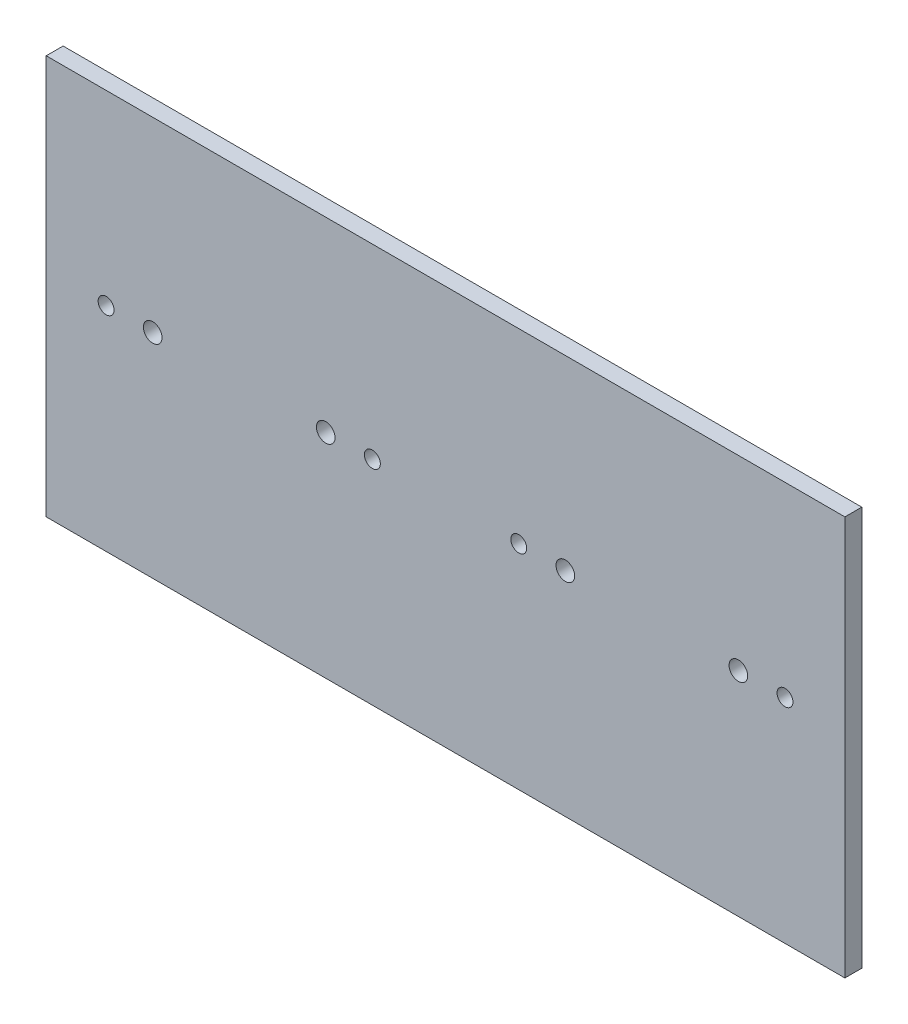
ISO-10303-21;
HEADER;
FILE_DESCRIPTION(('STEP AP214'),'2;1');
FILE_NAME('part.step','',(''),(''),'','','');
FILE_SCHEMA(('AUTOMOTIVE_DESIGN { 1 0 10303 214 1 1 1 1 }'));
ENDSEC;
DATA;
#1=APPLICATION_CONTEXT('core data for automotive mechanical design processes');
#2=APPLICATION_PROTOCOL_DEFINITION('international standard','automotive_design',2000,#1);
#3=PRODUCT_CONTEXT('',#1,'mechanical');
#4=PRODUCT('Part','Part','',(#3));
#5=PRODUCT_RELATED_PRODUCT_CATEGORY('part','',(#4));
#6=PRODUCT_DEFINITION_FORMATION('','',#4);
#7=PRODUCT_DEFINITION_CONTEXT('part definition',#1,'design');
#8=PRODUCT_DEFINITION('design','',#6,#7);
#9=PRODUCT_DEFINITION_SHAPE('','',#8);
#10=(LENGTH_UNIT() NAMED_UNIT(*) SI_UNIT(.MILLI.,.METRE.));
#11=(NAMED_UNIT(*) PLANE_ANGLE_UNIT() SI_UNIT($,.RADIAN.));
#12=(NAMED_UNIT(*) SI_UNIT($,.STERADIAN.) SOLID_ANGLE_UNIT());
#13=UNCERTAINTY_MEASURE_WITH_UNIT(LENGTH_MEASURE(1.E-05),#10,'distance_accuracy_value','');
#14=(GEOMETRIC_REPRESENTATION_CONTEXT(3) GLOBAL_UNCERTAINTY_ASSIGNED_CONTEXT((#13)) GLOBAL_UNIT_ASSIGNED_CONTEXT((#10,
#11,#12)) REPRESENTATION_CONTEXT('',''));
#15=CARTESIAN_POINT('',(0.,0.,0.));
#16=DIRECTION('',(0.,0.,1.));
#17=DIRECTION('',(1.,0.,0.));
#18=AXIS2_PLACEMENT_3D('',#15,#16,#17);
#19=CARTESIAN_POINT('',(0.,150.,6.35));
#20=DIRECTION('',(0.,0.,-1.));
#21=DIRECTION('',(-1.,0.,0.));
#22=AXIS2_PLACEMENT_3D('',#19,#20,#21);
#23=PLANE('',#22);
#24=CARTESIAN_POINT('',(195.,80.,6.35));
#25=DIRECTION('',(0.,0.,1.));
#26=DIRECTION('',(1.,0.,0.));
#27=AXIS2_PLACEMENT_3D('',#24,#25,#26);
#28=CIRCLE('',#27,3.49999999999999);
#29=CARTESIAN_POINT('',(198.5,80.,6.35));
#30=VERTEX_POINT('',#29);
#31=EDGE_CURVE('E145',#30,#30,#28,.T.);
#32=ORIENTED_EDGE('',*,*,#31,.F.);
#33=EDGE_LOOP('',(#32));
#34=FACE_BOUND('',#33,.T.);
#35=CARTESIAN_POINT('',(40.,80.,6.35));
#36=DIRECTION('',(0.,0.,1.));
#37=DIRECTION('',(1.,0.,0.));
#38=AXIS2_PLACEMENT_3D('',#35,#36,#37);
#39=CIRCLE('',#38,3.5);
#40=CARTESIAN_POINT('',(43.5,80.,6.35));
#41=VERTEX_POINT('',#40);
#42=EDGE_CURVE('E133',#41,#41,#39,.T.);
#43=ORIENTED_EDGE('',*,*,#42,.F.);
#44=EDGE_LOOP('',(#43));
#45=FACE_BOUND('',#44,.T.);
#46=CARTESIAN_POINT('',(277.5,80.,6.35));
#47=DIRECTION('',(0.,0.,1.));
#48=DIRECTION('',(1.,0.,0.));
#49=AXIS2_PLACEMENT_3D('',#46,#47,#48);
#50=CIRCLE('',#49,2.995);
#51=CARTESIAN_POINT('',(280.495,80.,6.35));
#52=VERTEX_POINT('',#51);
#53=EDGE_CURVE('E121',#52,#52,#50,.T.);
#54=ORIENTED_EDGE('',*,*,#53,.F.);
#55=EDGE_LOOP('',(#54));
#56=FACE_BOUND('',#55,.T.);
#57=CARTESIAN_POINT('',(22.5,80.,6.35));
#58=DIRECTION('',(0.,0.,1.));
#59=DIRECTION('',(1.,0.,0.));
#60=AXIS2_PLACEMENT_3D('',#57,#58,#59);
#61=CIRCLE('',#60,2.995);
#62=CARTESIAN_POINT('',(25.495,80.,6.35));
#63=VERTEX_POINT('',#62);
#64=EDGE_CURVE('E100',#63,#63,#61,.T.);
#65=ORIENTED_EDGE('',*,*,#64,.F.);
#66=EDGE_LOOP('',(#65));
#67=FACE_BOUND('',#66,.T.);
#68=DIRECTION('',(0.,-1.,0.));
#69=VECTOR('',#68,1.);
#70=CARTESIAN_POINT('',(0.,0.,6.35));
#71=LINE('',#70,#69);
#72=CARTESIAN_POINT('',(0.,150.,6.35));
#73=VERTEX_POINT('',#72);
#74=CARTESIAN_POINT('',(0.,0.,6.35));
#75=VERTEX_POINT('',#74);
#76=EDGE_CURVE('E85',#73,#75,#71,.T.);
#77=ORIENTED_EDGE('',*,*,#76,.T.);
#78=DIRECTION('',(1.,0.,0.));
#79=VECTOR('',#78,1.);
#80=CARTESIAN_POINT('',(0.,0.,6.35));
#81=LINE('',#80,#79);
#82=CARTESIAN_POINT('',(300.,0.,6.35));
#83=VERTEX_POINT('',#82);
#84=EDGE_CURVE('E80',#75,#83,#81,.T.);
#85=ORIENTED_EDGE('',*,*,#84,.T.);
#86=DIRECTION('',(0.,1.,0.));
#87=VECTOR('',#86,1.);
#88=CARTESIAN_POINT('',(300.,0.,6.35));
#89=LINE('',#88,#87);
#90=CARTESIAN_POINT('',(300.,150.,6.35));
#91=VERTEX_POINT('',#90);
#92=EDGE_CURVE('E83',#83,#91,#89,.T.);
#93=ORIENTED_EDGE('',*,*,#92,.T.);
#94=DIRECTION('',(-1.,0.,0.));
#95=VECTOR('',#94,1.);
#96=CARTESIAN_POINT('',(0.,150.,6.35));
#97=LINE('',#96,#95);
#98=EDGE_CURVE('E50',#91,#73,#97,.T.);
#99=ORIENTED_EDGE('',*,*,#98,.T.);
#100=EDGE_LOOP('',(#77,#85,#93,#99));
#101=FACE_BOUND('',#100,.T.);
#102=CARTESIAN_POINT('',(122.5,80.,6.35));
#103=DIRECTION('',(0.,0.,1.));
#104=DIRECTION('',(1.,0.,0.));
#105=AXIS2_PLACEMENT_3D('',#102,#103,#104);
#106=CIRCLE('',#105,2.995);
#107=CARTESIAN_POINT('',(125.495,80.,6.35));
#108=VERTEX_POINT('',#107);
#109=EDGE_CURVE('E115',#108,#108,#106,.T.);
#110=ORIENTED_EDGE('',*,*,#109,.F.);
#111=EDGE_LOOP('',(#110));
#112=FACE_BOUND('',#111,.T.);
#113=CARTESIAN_POINT('',(177.5,80.,6.35));
#114=DIRECTION('',(0.,0.,1.));
#115=DIRECTION('',(1.,0.,0.));
#116=AXIS2_PLACEMENT_3D('',#113,#114,#115);
#117=CIRCLE('',#116,2.995);
#118=CARTESIAN_POINT('',(180.495,80.,6.35));
#119=VERTEX_POINT('',#118);
#120=EDGE_CURVE('E127',#119,#119,#117,.T.);
#121=ORIENTED_EDGE('',*,*,#120,.F.);
#122=EDGE_LOOP('',(#121));
#123=FACE_BOUND('',#122,.T.);
#124=CARTESIAN_POINT('',(105.,80.,6.35));
#125=DIRECTION('',(0.,0.,1.));
#126=DIRECTION('',(1.,0.,0.));
#127=AXIS2_PLACEMENT_3D('',#124,#125,#126);
#128=CIRCLE('',#127,3.50000000000001);
#129=CARTESIAN_POINT('',(108.5,80.,6.35));
#130=VERTEX_POINT('',#129);
#131=EDGE_CURVE('E139',#130,#130,#128,.T.);
#132=ORIENTED_EDGE('',*,*,#131,.F.);
#133=EDGE_LOOP('',(#132));
#134=FACE_BOUND('',#133,.T.);
#135=CARTESIAN_POINT('',(260.,80.,6.35));
#136=DIRECTION('',(0.,0.,1.));
#137=DIRECTION('',(1.,0.,0.));
#138=AXIS2_PLACEMENT_3D('',#135,#136,#137);
#139=CIRCLE('',#138,3.50000000000002);
#140=CARTESIAN_POINT('',(263.5,80.,6.35));
#141=VERTEX_POINT('',#140);
#142=EDGE_CURVE('E151',#141,#141,#139,.T.);
#143=ORIENTED_EDGE('',*,*,#142,.F.);
#144=EDGE_LOOP('',(#143));
#145=FACE_BOUND('',#144,.T.);
#146=ADVANCED_FACE('F33',(#34,#45,#56,#67,#101,#112,#123,#134,#145),#23,.F.);
#147=CARTESIAN_POINT('',(0.,150.,0.));
#148=DIRECTION('',(0.,0.,-1.));
#149=DIRECTION('',(-1.,0.,0.));
#150=AXIS2_PLACEMENT_3D('',#147,#148,#149);
#151=PLANE('',#150);
#152=CARTESIAN_POINT('',(195.,80.,0.));
#153=DIRECTION('',(0.,0.,1.));
#154=DIRECTION('',(1.,0.,0.));
#155=AXIS2_PLACEMENT_3D('',#152,#153,#154);
#156=CIRCLE('',#155,3.49999999999999);
#157=CARTESIAN_POINT('',(198.5,80.,0.));
#158=VERTEX_POINT('',#157);
#159=EDGE_CURVE('E148',#158,#158,#156,.T.);
#160=ORIENTED_EDGE('',*,*,#159,.T.);
#161=EDGE_LOOP('',(#160));
#162=FACE_BOUND('',#161,.T.);
#163=CARTESIAN_POINT('',(40.,80.,0.));
#164=DIRECTION('',(0.,0.,1.));
#165=DIRECTION('',(1.,0.,0.));
#166=AXIS2_PLACEMENT_3D('',#163,#164,#165);
#167=CIRCLE('',#166,3.5);
#168=CARTESIAN_POINT('',(43.5,80.,0.));
#169=VERTEX_POINT('',#168);
#170=EDGE_CURVE('E136',#169,#169,#167,.T.);
#171=ORIENTED_EDGE('',*,*,#170,.T.);
#172=EDGE_LOOP('',(#171));
#173=FACE_BOUND('',#172,.T.);
#174=CARTESIAN_POINT('',(277.5,80.,0.));
#175=DIRECTION('',(0.,0.,1.));
#176=DIRECTION('',(1.,0.,0.));
#177=AXIS2_PLACEMENT_3D('',#174,#175,#176);
#178=CIRCLE('',#177,2.995);
#179=CARTESIAN_POINT('',(280.495,80.,0.));
#180=VERTEX_POINT('',#179);
#181=EDGE_CURVE('E124',#180,#180,#178,.T.);
#182=ORIENTED_EDGE('',*,*,#181,.T.);
#183=EDGE_LOOP('',(#182));
#184=FACE_BOUND('',#183,.T.);
#185=CARTESIAN_POINT('',(22.5,80.,0.));
#186=DIRECTION('',(0.,0.,1.));
#187=DIRECTION('',(1.,0.,0.));
#188=AXIS2_PLACEMENT_3D('',#185,#186,#187);
#189=CIRCLE('',#188,2.995);
#190=CARTESIAN_POINT('',(25.495,80.,0.));
#191=VERTEX_POINT('',#190);
#192=EDGE_CURVE('E112',#191,#191,#189,.T.);
#193=ORIENTED_EDGE('',*,*,#192,.T.);
#194=EDGE_LOOP('',(#193));
#195=FACE_BOUND('',#194,.T.);
#196=DIRECTION('',(0.,-1.,0.));
#197=VECTOR('',#196,1.);
#198=CARTESIAN_POINT('',(0.,0.,0.));
#199=LINE('',#198,#197);
#200=CARTESIAN_POINT('',(0.,150.,0.));
#201=VERTEX_POINT('',#200);
#202=CARTESIAN_POINT('',(0.,0.,0.));
#203=VERTEX_POINT('',#202);
#204=EDGE_CURVE('E97',#201,#203,#199,.T.);
#205=ORIENTED_EDGE('',*,*,#204,.F.);
#206=DIRECTION('',(-1.,0.,0.));
#207=VECTOR('',#206,1.);
#208=CARTESIAN_POINT('',(0.,150.,0.));
#209=LINE('',#208,#207);
#210=CARTESIAN_POINT('',(300.,150.,0.));
#211=VERTEX_POINT('',#210);
#212=EDGE_CURVE('E73',#211,#201,#209,.T.);
#213=ORIENTED_EDGE('',*,*,#212,.F.);
#214=DIRECTION('',(0.,1.,0.));
#215=VECTOR('',#214,1.);
#216=CARTESIAN_POINT('',(300.,0.,0.));
#217=LINE('',#216,#215);
#218=CARTESIAN_POINT('',(300.,0.,0.));
#219=VERTEX_POINT('',#218);
#220=EDGE_CURVE('E67',#219,#211,#217,.T.);
#221=ORIENTED_EDGE('',*,*,#220,.F.);
#222=DIRECTION('',(1.,0.,0.));
#223=VECTOR('',#222,1.);
#224=CARTESIAN_POINT('',(0.,0.,0.));
#225=LINE('',#224,#223);
#226=EDGE_CURVE('E89',#203,#219,#225,.T.);
#227=ORIENTED_EDGE('',*,*,#226,.F.);
#228=EDGE_LOOP('',(#205,#213,#221,#227));
#229=FACE_BOUND('',#228,.T.);
#230=CARTESIAN_POINT('',(122.5,80.,0.));
#231=DIRECTION('',(0.,0.,1.));
#232=DIRECTION('',(1.,0.,0.));
#233=AXIS2_PLACEMENT_3D('',#230,#231,#232);
#234=CIRCLE('',#233,2.995);
#235=CARTESIAN_POINT('',(125.495,80.,0.));
#236=VERTEX_POINT('',#235);
#237=EDGE_CURVE('E118',#236,#236,#234,.T.);
#238=ORIENTED_EDGE('',*,*,#237,.T.);
#239=EDGE_LOOP('',(#238));
#240=FACE_BOUND('',#239,.T.);
#241=CARTESIAN_POINT('',(177.5,80.,0.));
#242=DIRECTION('',(0.,0.,1.));
#243=DIRECTION('',(1.,0.,0.));
#244=AXIS2_PLACEMENT_3D('',#241,#242,#243);
#245=CIRCLE('',#244,2.995);
#246=CARTESIAN_POINT('',(180.495,80.,0.));
#247=VERTEX_POINT('',#246);
#248=EDGE_CURVE('E130',#247,#247,#245,.T.);
#249=ORIENTED_EDGE('',*,*,#248,.T.);
#250=EDGE_LOOP('',(#249));
#251=FACE_BOUND('',#250,.T.);
#252=CARTESIAN_POINT('',(105.,80.,0.));
#253=DIRECTION('',(0.,0.,1.));
#254=DIRECTION('',(1.,0.,0.));
#255=AXIS2_PLACEMENT_3D('',#252,#253,#254);
#256=CIRCLE('',#255,3.50000000000001);
#257=CARTESIAN_POINT('',(108.5,80.,0.));
#258=VERTEX_POINT('',#257);
#259=EDGE_CURVE('E142',#258,#258,#256,.T.);
#260=ORIENTED_EDGE('',*,*,#259,.T.);
#261=EDGE_LOOP('',(#260));
#262=FACE_BOUND('',#261,.T.);
#263=CARTESIAN_POINT('',(260.,80.,0.));
#264=DIRECTION('',(0.,0.,1.));
#265=DIRECTION('',(1.,0.,0.));
#266=AXIS2_PLACEMENT_3D('',#263,#264,#265);
#267=CIRCLE('',#266,3.50000000000002);
#268=CARTESIAN_POINT('',(263.5,80.,0.));
#269=VERTEX_POINT('',#268);
#270=EDGE_CURVE('E154',#269,#269,#267,.T.);
#271=ORIENTED_EDGE('',*,*,#270,.T.);
#272=EDGE_LOOP('',(#271));
#273=FACE_BOUND('',#272,.T.);
#274=ADVANCED_FACE('F108',(#162,#173,#184,#195,#229,#240,#251,#262,#273),#151,.T.);
#275=CARTESIAN_POINT('',(0.,0.,6.35));
#276=DIRECTION('',(1.,0.,0.));
#277=DIRECTION('',(0.,0.,-1.));
#278=AXIS2_PLACEMENT_3D('',#275,#276,#277);
#279=PLANE('',#278);
#280=ORIENTED_EDGE('',*,*,#204,.T.);
#281=DIRECTION('',(0.,0.,-1.));
#282=VECTOR('',#281,1.);
#283=CARTESIAN_POINT('',(0.,0.,6.35));
#284=LINE('',#283,#282);
#285=EDGE_CURVE('E11',#75,#203,#284,.T.);
#286=ORIENTED_EDGE('',*,*,#285,.F.);
#287=ORIENTED_EDGE('',*,*,#76,.F.);
#288=DIRECTION('',(0.,0.,-1.));
#289=VECTOR('',#288,1.);
#290=CARTESIAN_POINT('',(0.,150.,6.35));
#291=LINE('',#290,#289);
#292=EDGE_CURVE('E93',#73,#201,#291,.T.);
#293=ORIENTED_EDGE('',*,*,#292,.T.);
#294=EDGE_LOOP('',(#280,#286,#287,#293));
#295=FACE_BOUND('',#294,.T.);
#296=ADVANCED_FACE('F35',(#295),#279,.F.);
#297=CARTESIAN_POINT('',(0.,0.,6.35));
#298=DIRECTION('',(0.,1.,0.));
#299=DIRECTION('',(0.,0.,1.));
#300=AXIS2_PLACEMENT_3D('',#297,#298,#299);
#301=PLANE('',#300);
#302=ORIENTED_EDGE('',*,*,#226,.T.);
#303=DIRECTION('',(0.,0.,-1.));
#304=VECTOR('',#303,1.);
#305=CARTESIAN_POINT('',(300.,0.,6.35));
#306=LINE('',#305,#304);
#307=EDGE_CURVE('E42',#83,#219,#306,.T.);
#308=ORIENTED_EDGE('',*,*,#307,.F.);
#309=ORIENTED_EDGE('',*,*,#84,.F.);
#310=ORIENTED_EDGE('',*,*,#285,.T.);
#311=EDGE_LOOP('',(#302,#308,#309,#310));
#312=FACE_BOUND('',#311,.T.);
#313=ADVANCED_FACE('F88',(#312),#301,.F.);
#314=CARTESIAN_POINT('',(300.,0.,6.35));
#315=DIRECTION('',(-1.,0.,0.));
#316=DIRECTION('',(0.,0.,1.));
#317=AXIS2_PLACEMENT_3D('',#314,#315,#316);
#318=PLANE('',#317);
#319=ORIENTED_EDGE('',*,*,#220,.T.);
#320=DIRECTION('',(0.,0.,-1.));
#321=VECTOR('',#320,1.);
#322=CARTESIAN_POINT('',(300.,150.,6.35));
#323=LINE('',#322,#321);
#324=EDGE_CURVE('E90',#91,#211,#323,.T.);
#325=ORIENTED_EDGE('',*,*,#324,.F.);
#326=ORIENTED_EDGE('',*,*,#92,.F.);
#327=ORIENTED_EDGE('',*,*,#307,.T.);
#328=EDGE_LOOP('',(#319,#325,#326,#327));
#329=FACE_BOUND('',#328,.T.);
#330=ADVANCED_FACE('F91',(#329),#318,.F.);
#331=CARTESIAN_POINT('',(0.,150.,6.35));
#332=DIRECTION('',(0.,-1.,0.));
#333=DIRECTION('',(0.,0.,-1.));
#334=AXIS2_PLACEMENT_3D('',#331,#332,#333);
#335=PLANE('',#334);
#336=ORIENTED_EDGE('',*,*,#212,.T.);
#337=ORIENTED_EDGE('',*,*,#292,.F.);
#338=ORIENTED_EDGE('',*,*,#98,.F.);
#339=ORIENTED_EDGE('',*,*,#324,.T.);
#340=EDGE_LOOP('',(#336,#337,#338,#339));
#341=FACE_BOUND('',#340,.T.);
#342=ADVANCED_FACE('F105',(#341),#335,.F.);
#343=CARTESIAN_POINT('',(22.5,80.,6.35));
#344=DIRECTION('',(0.,0.,-1.));
#345=DIRECTION('',(-1.,0.,0.));
#346=AXIS2_PLACEMENT_3D('',#343,#344,#345);
#347=CYLINDRICAL_SURFACE('',#346,2.995);
#348=ORIENTED_EDGE('',*,*,#64,.T.);
#349=EDGE_LOOP('',(#348));
#350=FACE_BOUND('',#349,.T.);
#351=ORIENTED_EDGE('',*,*,#192,.F.);
#352=EDGE_LOOP('',(#351));
#353=FACE_BOUND('',#352,.T.);
#354=ADVANCED_FACE('F174',(#350,#353),#347,.F.);
#355=CARTESIAN_POINT('',(122.5,80.,6.35));
#356=DIRECTION('',(0.,0.,-1.));
#357=DIRECTION('',(-1.,0.,0.));
#358=AXIS2_PLACEMENT_3D('',#355,#356,#357);
#359=CYLINDRICAL_SURFACE('',#358,2.995);
#360=ORIENTED_EDGE('',*,*,#109,.T.);
#361=EDGE_LOOP('',(#360));
#362=FACE_BOUND('',#361,.T.);
#363=ORIENTED_EDGE('',*,*,#237,.F.);
#364=EDGE_LOOP('',(#363));
#365=FACE_BOUND('',#364,.T.);
#366=ADVANCED_FACE('F220',(#362,#365),#359,.F.);
#367=CARTESIAN_POINT('',(277.5,80.,6.35));
#368=DIRECTION('',(0.,0.,-1.));
#369=DIRECTION('',(-1.,0.,0.));
#370=AXIS2_PLACEMENT_3D('',#367,#368,#369);
#371=CYLINDRICAL_SURFACE('',#370,2.995);
#372=ORIENTED_EDGE('',*,*,#53,.T.);
#373=EDGE_LOOP('',(#372));
#374=FACE_BOUND('',#373,.T.);
#375=ORIENTED_EDGE('',*,*,#181,.F.);
#376=EDGE_LOOP('',(#375));
#377=FACE_BOUND('',#376,.T.);
#378=ADVANCED_FACE('F228',(#374,#377),#371,.F.);
#379=CARTESIAN_POINT('',(177.5,80.,6.35));
#380=DIRECTION('',(0.,0.,-1.));
#381=DIRECTION('',(-1.,0.,0.));
#382=AXIS2_PLACEMENT_3D('',#379,#380,#381);
#383=CYLINDRICAL_SURFACE('',#382,2.995);
#384=ORIENTED_EDGE('',*,*,#120,.T.);
#385=EDGE_LOOP('',(#384));
#386=FACE_BOUND('',#385,.T.);
#387=ORIENTED_EDGE('',*,*,#248,.F.);
#388=EDGE_LOOP('',(#387));
#389=FACE_BOUND('',#388,.T.);
#390=ADVANCED_FACE('F236',(#386,#389),#383,.F.);
#391=CARTESIAN_POINT('',(40.,80.,6.35));
#392=DIRECTION('',(0.,0.,-1.));
#393=DIRECTION('',(-1.,0.,0.));
#394=AXIS2_PLACEMENT_3D('',#391,#392,#393);
#395=CYLINDRICAL_SURFACE('',#394,3.5);
#396=ORIENTED_EDGE('',*,*,#42,.T.);
#397=EDGE_LOOP('',(#396));
#398=FACE_BOUND('',#397,.T.);
#399=ORIENTED_EDGE('',*,*,#170,.F.);
#400=EDGE_LOOP('',(#399));
#401=FACE_BOUND('',#400,.T.);
#402=ADVANCED_FACE('F245',(#398,#401),#395,.F.);
#403=CARTESIAN_POINT('',(105.,80.,6.35));
#404=DIRECTION('',(0.,0.,-1.));
#405=DIRECTION('',(-1.,0.,0.));
#406=AXIS2_PLACEMENT_3D('',#403,#404,#405);
#407=CYLINDRICAL_SURFACE('',#406,3.50000000000001);
#408=ORIENTED_EDGE('',*,*,#131,.T.);
#409=EDGE_LOOP('',(#408));
#410=FACE_BOUND('',#409,.T.);
#411=ORIENTED_EDGE('',*,*,#259,.F.);
#412=EDGE_LOOP('',(#411));
#413=FACE_BOUND('',#412,.T.);
#414=ADVANCED_FACE('F254',(#410,#413),#407,.F.);
#415=CARTESIAN_POINT('',(195.,80.,6.35));
#416=DIRECTION('',(0.,0.,-1.));
#417=DIRECTION('',(-1.,0.,0.));
#418=AXIS2_PLACEMENT_3D('',#415,#416,#417);
#419=CYLINDRICAL_SURFACE('',#418,3.49999999999999);
#420=ORIENTED_EDGE('',*,*,#31,.T.);
#421=EDGE_LOOP('',(#420));
#422=FACE_BOUND('',#421,.T.);
#423=ORIENTED_EDGE('',*,*,#159,.F.);
#424=EDGE_LOOP('',(#423));
#425=FACE_BOUND('',#424,.T.);
#426=ADVANCED_FACE('F263',(#422,#425),#419,.F.);
#427=CARTESIAN_POINT('',(260.,80.,6.35));
#428=DIRECTION('',(0.,0.,-1.));
#429=DIRECTION('',(-1.,0.,0.));
#430=AXIS2_PLACEMENT_3D('',#427,#428,#429);
#431=CYLINDRICAL_SURFACE('',#430,3.50000000000002);
#432=ORIENTED_EDGE('',*,*,#142,.T.);
#433=EDGE_LOOP('',(#432));
#434=FACE_BOUND('',#433,.T.);
#435=ORIENTED_EDGE('',*,*,#270,.F.);
#436=EDGE_LOOP('',(#435));
#437=FACE_BOUND('',#436,.T.);
#438=ADVANCED_FACE('F160',(#434,#437),#431,.F.);
#439=CLOSED_SHELL('',(#146,#274,#296,#313,#330,#342,#354,#366,#378,#390,#402,#414,#426,#438));
#440=MANIFOLD_SOLID_BREP('B2',#439);
#441=ADVANCED_BREP_SHAPE_REPRESENTATION('',(#18,#440),#14);
#442=SHAPE_DEFINITION_REPRESENTATION(#9,#441);
ENDSEC;
END-ISO-10303-21;
